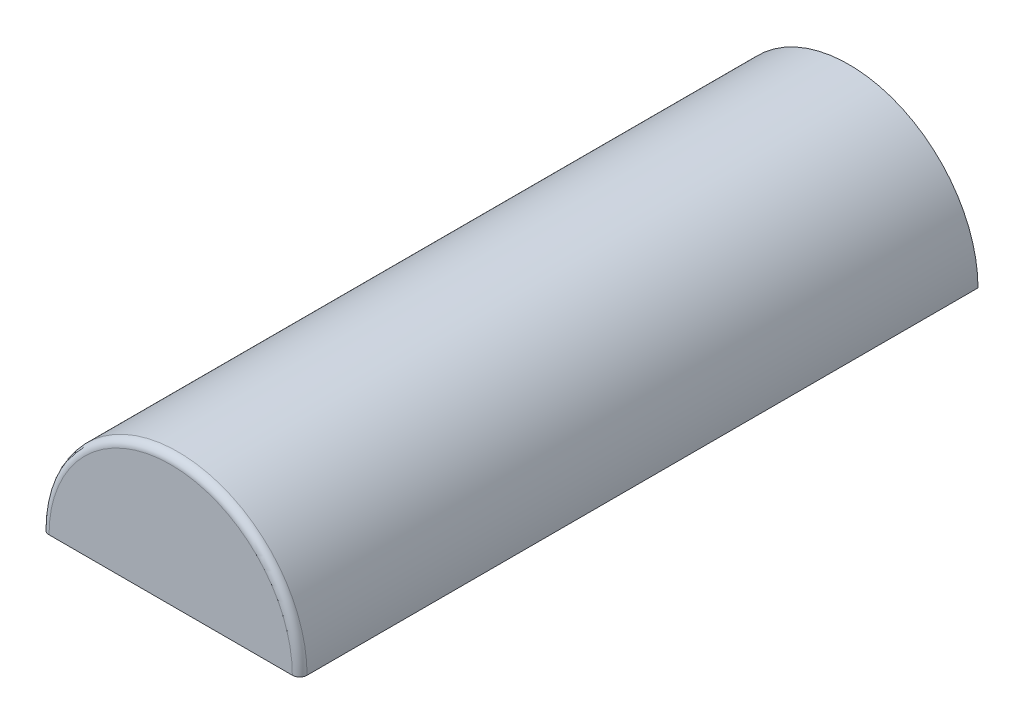
ISO-10303-21;
HEADER;
FILE_DESCRIPTION(('STEP AP214'),'2;1');
FILE_NAME('part.step','',(''),(''),'','','');
FILE_SCHEMA(('AUTOMOTIVE_DESIGN { 1 0 10303 214 1 1 1 1 }'));
ENDSEC;
DATA;
#1=APPLICATION_CONTEXT('core data for automotive mechanical design processes');
#2=APPLICATION_PROTOCOL_DEFINITION('international standard','automotive_design',2000,#1);
#3=PRODUCT_CONTEXT('',#1,'mechanical');
#4=PRODUCT('Part','Part','',(#3));
#5=PRODUCT_RELATED_PRODUCT_CATEGORY('part','',(#4));
#6=PRODUCT_DEFINITION_FORMATION('','',#4);
#7=PRODUCT_DEFINITION_CONTEXT('part definition',#1,'design');
#8=PRODUCT_DEFINITION('design','',#6,#7);
#9=PRODUCT_DEFINITION_SHAPE('','',#8);
#10=(LENGTH_UNIT() NAMED_UNIT(*) SI_UNIT(.MILLI.,.METRE.));
#11=(NAMED_UNIT(*) PLANE_ANGLE_UNIT() SI_UNIT($,.RADIAN.));
#12=(NAMED_UNIT(*) SI_UNIT($,.STERADIAN.) SOLID_ANGLE_UNIT());
#13=UNCERTAINTY_MEASURE_WITH_UNIT(LENGTH_MEASURE(1.E-05),#10,'distance_accuracy_value','');
#14=(GEOMETRIC_REPRESENTATION_CONTEXT(3) GLOBAL_UNCERTAINTY_ASSIGNED_CONTEXT((#13)) GLOBAL_UNIT_ASSIGNED_CONTEXT((#10,
#11,#12)) REPRESENTATION_CONTEXT('',''));
#15=CARTESIAN_POINT('',(0.,0.,0.));
#16=DIRECTION('',(0.,0.,1.));
#17=DIRECTION('',(1.,0.,0.));
#18=AXIS2_PLACEMENT_3D('',#15,#16,#17);
#19=CARTESIAN_POINT('',(-175.,0.,920.));
#20=DIRECTION('',(0.,1.,0.));
#21=DIRECTION('',(0.,0.,1.));
#22=AXIS2_PLACEMENT_3D('',#19,#20,#21);
#23=PLANE('',#22);
#24=DIRECTION('',(1.,0.,0.));
#25=VECTOR('',#24,1.);
#26=CARTESIAN_POINT('',(-175.,0.,920.));
#27=LINE('',#26,#25);
#28=CARTESIAN_POINT('',(-165.,0.,920.));
#29=VERTEX_POINT('',#28);
#30=CARTESIAN_POINT('',(165.,0.,920.));
#31=VERTEX_POINT('',#30);
#32=EDGE_CURVE('E118',#29,#31,#27,.T.);
#33=ORIENTED_EDGE('',*,*,#32,.F.);
#34=CARTESIAN_POINT('',(-165.,0.,910.));
#35=DIRECTION('',(0.,1.,0.));
#36=DIRECTION('',(0.,0.,1.));
#37=AXIS2_PLACEMENT_3D('',#34,#35,#36);
#38=CIRCLE('',#37,10.);
#39=CARTESIAN_POINT('',(-175.,0.,910.));
#40=VERTEX_POINT('',#39);
#41=EDGE_CURVE('E49',#29,#40,#38,.F.);
#42=ORIENTED_EDGE('',*,*,#41,.T.);
#43=DIRECTION('',(0.,0.,-1.));
#44=VECTOR('',#43,1.);
#45=CARTESIAN_POINT('',(-175.,0.,920.));
#46=LINE('',#45,#44);
#47=CARTESIAN_POINT('',(-175.,0.,0.));
#48=VERTEX_POINT('',#47);
#49=EDGE_CURVE('E129',#40,#48,#46,.T.);
#50=ORIENTED_EDGE('',*,*,#49,.T.);
#51=DIRECTION('',(1.,0.,0.));
#52=VECTOR('',#51,1.);
#53=CARTESIAN_POINT('',(-175.,0.,0.));
#54=LINE('',#53,#52);
#55=CARTESIAN_POINT('',(175.,0.,0.));
#56=VERTEX_POINT('',#55);
#57=EDGE_CURVE('E122',#48,#56,#54,.T.);
#58=ORIENTED_EDGE('',*,*,#57,.T.);
#59=DIRECTION('',(0.,0.,-1.));
#60=VECTOR('',#59,1.);
#61=CARTESIAN_POINT('',(175.,0.,920.));
#62=LINE('',#61,#60);
#63=CARTESIAN_POINT('',(175.,0.,910.));
#64=VERTEX_POINT('',#63);
#65=EDGE_CURVE('E121',#64,#56,#62,.T.);
#66=ORIENTED_EDGE('',*,*,#65,.F.);
#67=CARTESIAN_POINT('',(165.,0.,910.));
#68=DIRECTION('',(0.,1.,0.));
#69=DIRECTION('',(0.,0.,1.));
#70=AXIS2_PLACEMENT_3D('',#67,#68,#69);
#71=CIRCLE('',#70,10.);
#72=EDGE_CURVE('E134',#64,#31,#71,.F.);
#73=ORIENTED_EDGE('',*,*,#72,.T.);
#74=EDGE_LOOP('',(#33,#42,#50,#58,#66,#73));
#75=FACE_BOUND('',#74,.T.);
#76=CARTESIAN_POINT('',(-165.,0.,910.));
#77=DIRECTION('',(0.,1.,0.));
#78=DIRECTION('',(0.,0.,1.));
#79=AXIS2_PLACEMENT_3D('',#76,#77,#78);
#80=CIRCLE('',#79,8.);
#81=CARTESIAN_POINT('',(-165.,0.,918.));
#82=VERTEX_POINT('',#81);
#83=CARTESIAN_POINT('',(-173.,0.,910.));
#84=VERTEX_POINT('',#83);
#85=EDGE_CURVE('E115',#82,#84,#80,.F.);
#86=ORIENTED_EDGE('',*,*,#85,.F.);
#87=DIRECTION('',(1.,0.,0.));
#88=VECTOR('',#87,1.);
#89=CARTESIAN_POINT('',(-175.,0.,918.));
#90=LINE('',#89,#88);
#91=CARTESIAN_POINT('',(165.,0.,918.));
#92=VERTEX_POINT('',#91);
#93=EDGE_CURVE('E107',#82,#92,#90,.T.);
#94=ORIENTED_EDGE('',*,*,#93,.T.);
#95=CARTESIAN_POINT('',(165.,0.,910.));
#96=DIRECTION('',(0.,1.,0.));
#97=DIRECTION('',(0.,0.,1.));
#98=AXIS2_PLACEMENT_3D('',#95,#96,#97);
#99=CIRCLE('',#98,8.);
#100=CARTESIAN_POINT('',(173.,0.,910.));
#101=VERTEX_POINT('',#100);
#102=EDGE_CURVE('E114',#101,#92,#99,.F.);
#103=ORIENTED_EDGE('',*,*,#102,.F.);
#104=DIRECTION('',(0.,0.,-1.));
#105=VECTOR('',#104,1.);
#106=CARTESIAN_POINT('',(173.,0.,910.));
#107=LINE('',#106,#105);
#108=CARTESIAN_POINT('',(173.,0.,2.));
#109=VERTEX_POINT('',#108);
#110=EDGE_CURVE('E56',#101,#109,#107,.T.);
#111=ORIENTED_EDGE('',*,*,#110,.T.);
#112=DIRECTION('',(1.,0.,0.));
#113=VECTOR('',#112,1.);
#114=CARTESIAN_POINT('',(-175.,0.,2.));
#115=LINE('',#114,#113);
#116=CARTESIAN_POINT('',(-173.,0.,2.));
#117=VERTEX_POINT('',#116);
#118=EDGE_CURVE('E104',#117,#109,#115,.T.);
#119=ORIENTED_EDGE('',*,*,#118,.F.);
#120=DIRECTION('',(0.,0.,-1.));
#121=VECTOR('',#120,1.);
#122=CARTESIAN_POINT('',(-173.,0.,910.));
#123=LINE('',#122,#121);
#124=EDGE_CURVE('E92',#84,#117,#123,.T.);
#125=ORIENTED_EDGE('',*,*,#124,.F.);
#126=EDGE_LOOP('',(#86,#94,#103,#111,#119,#125));
#127=FACE_BOUND('',#126,.T.);
#128=ADVANCED_FACE('F41',(#75,#127),#23,.F.);
#129=CARTESIAN_POINT('',(0.,0.,920.));
#130=DIRECTION('',(0.,0.,-1.));
#131=DIRECTION('',(-1.,0.,0.));
#132=AXIS2_PLACEMENT_3D('',#129,#130,#131);
#133=CYLINDRICAL_SURFACE('',#132,175.);
#134=ORIENTED_EDGE('',*,*,#49,.F.);
#135=CARTESIAN_POINT('',(0.,0.,910.));
#136=DIRECTION('',(0.,0.,1.));
#137=DIRECTION('',(1.,0.,0.));
#138=AXIS2_PLACEMENT_3D('',#135,#136,#137);
#139=CIRCLE('',#138,175.);
#140=EDGE_CURVE('E11',#40,#64,#139,.F.);
#141=ORIENTED_EDGE('',*,*,#140,.T.);
#142=ORIENTED_EDGE('',*,*,#65,.T.);
#143=CARTESIAN_POINT('',(0.,0.,0.));
#144=DIRECTION('',(0.,0.,1.));
#145=DIRECTION('',(1.,0.,0.));
#146=AXIS2_PLACEMENT_3D('',#143,#144,#145);
#147=CIRCLE('',#146,175.);
#148=EDGE_CURVE('E123',#56,#48,#147,.T.);
#149=ORIENTED_EDGE('',*,*,#148,.T.);
#150=EDGE_LOOP('',(#134,#141,#142,#149));
#151=FACE_BOUND('',#150,.T.);
#152=ADVANCED_FACE('F143',(#151),#133,.T.);
#153=CARTESIAN_POINT('',(0.,0.,920.));
#154=DIRECTION('',(0.,0.,1.));
#155=DIRECTION('',(1.,0.,0.));
#156=AXIS2_PLACEMENT_3D('',#153,#154,#155);
#157=PLANE('',#156);
#158=ORIENTED_EDGE('',*,*,#32,.T.);
#159=CARTESIAN_POINT('',(0.,0.,920.));
#160=DIRECTION('',(0.,0.,1.));
#161=DIRECTION('',(1.,0.,0.));
#162=AXIS2_PLACEMENT_3D('',#159,#160,#161);
#163=CIRCLE('',#162,165.);
#164=EDGE_CURVE('E131',#31,#29,#163,.T.);
#165=ORIENTED_EDGE('',*,*,#164,.T.);
#166=EDGE_LOOP('',(#158,#165));
#167=FACE_BOUND('',#166,.T.);
#168=ADVANCED_FACE('F141',(#167),#157,.T.);
#169=CARTESIAN_POINT('',(0.,0.,0.));
#170=DIRECTION('',(0.,0.,1.));
#171=DIRECTION('',(1.,0.,0.));
#172=AXIS2_PLACEMENT_3D('',#169,#170,#171);
#173=PLANE('',#172);
#174=ORIENTED_EDGE('',*,*,#148,.F.);
#175=ORIENTED_EDGE('',*,*,#57,.F.);
#176=EDGE_LOOP('',(#174,#175));
#177=FACE_BOUND('',#176,.T.);
#178=ADVANCED_FACE('F147',(#177),#173,.F.);
#179=CARTESIAN_POINT('',(0.,0.,910.));
#180=DIRECTION('',(0.,0.,1.));
#181=DIRECTION('',(1.,0.,0.));
#182=AXIS2_PLACEMENT_3D('',#179,#180,#181);
#183=TOROIDAL_SURFACE('',#182,165.,10.);
#184=ORIENTED_EDGE('',*,*,#72,.F.);
#185=ORIENTED_EDGE('',*,*,#140,.F.);
#186=ORIENTED_EDGE('',*,*,#41,.F.);
#187=ORIENTED_EDGE('',*,*,#164,.F.);
#188=EDGE_LOOP('',(#184,#185,#186,#187));
#189=FACE_BOUND('',#188,.T.);
#190=ADVANCED_FACE('F43',(#189),#183,.T.);
#191=CARTESIAN_POINT('',(0.,0.,920.));
#192=DIRECTION('',(0.,0.,-1.));
#193=DIRECTION('',(-1.,0.,0.));
#194=AXIS2_PLACEMENT_3D('',#191,#192,#193);
#195=CYLINDRICAL_SURFACE('',#194,173.);
#196=ORIENTED_EDGE('',*,*,#124,.T.);
#197=CARTESIAN_POINT('',(0.,0.,2.));
#198=DIRECTION('',(0.,0.,1.));
#199=DIRECTION('',(1.,0.,0.));
#200=AXIS2_PLACEMENT_3D('',#197,#198,#199);
#201=CIRCLE('',#200,173.);
#202=EDGE_CURVE('E95',#109,#117,#201,.T.);
#203=ORIENTED_EDGE('',*,*,#202,.F.);
#204=ORIENTED_EDGE('',*,*,#110,.F.);
#205=CARTESIAN_POINT('',(0.,0.,910.));
#206=DIRECTION('',(0.,0.,-1.));
#207=DIRECTION('',(-1.,0.,0.));
#208=AXIS2_PLACEMENT_3D('',#205,#206,#207);
#209=CIRCLE('',#208,173.);
#210=EDGE_CURVE('E96',#84,#101,#209,.T.);
#211=ORIENTED_EDGE('',*,*,#210,.F.);
#212=EDGE_LOOP('',(#196,#203,#204,#211));
#213=FACE_BOUND('',#212,.T.);
#214=ADVANCED_FACE('F94',(#213),#195,.F.);
#215=CARTESIAN_POINT('',(0.,0.,918.));
#216=DIRECTION('',(0.,0.,1.));
#217=DIRECTION('',(1.,0.,0.));
#218=AXIS2_PLACEMENT_3D('',#215,#216,#217);
#219=PLANE('',#218);
#220=ORIENTED_EDGE('',*,*,#93,.F.);
#221=CARTESIAN_POINT('',(0.,0.,918.));
#222=DIRECTION('',(0.,0.,1.));
#223=DIRECTION('',(1.,0.,0.));
#224=AXIS2_PLACEMENT_3D('',#221,#222,#223);
#225=CIRCLE('',#224,165.);
#226=EDGE_CURVE('E100',#92,#82,#225,.T.);
#227=ORIENTED_EDGE('',*,*,#226,.F.);
#228=EDGE_LOOP('',(#220,#227));
#229=FACE_BOUND('',#228,.T.);
#230=ADVANCED_FACE('F186',(#229),#219,.F.);
#231=CARTESIAN_POINT('',(0.,0.,2.));
#232=DIRECTION('',(0.,0.,1.));
#233=DIRECTION('',(1.,0.,0.));
#234=AXIS2_PLACEMENT_3D('',#231,#232,#233);
#235=PLANE('',#234);
#236=ORIENTED_EDGE('',*,*,#202,.T.);
#237=ORIENTED_EDGE('',*,*,#118,.T.);
#238=EDGE_LOOP('',(#236,#237));
#239=FACE_BOUND('',#238,.T.);
#240=ADVANCED_FACE('F103',(#239),#235,.T.);
#241=CARTESIAN_POINT('',(0.,0.,910.));
#242=DIRECTION('',(0.,0.,1.));
#243=DIRECTION('',(1.,0.,0.));
#244=AXIS2_PLACEMENT_3D('',#241,#242,#243);
#245=TOROIDAL_SURFACE('',#244,165.,8.);
#246=ORIENTED_EDGE('',*,*,#102,.T.);
#247=ORIENTED_EDGE('',*,*,#226,.T.);
#248=ORIENTED_EDGE('',*,*,#85,.T.);
#249=ORIENTED_EDGE('',*,*,#210,.T.);
#250=EDGE_LOOP('',(#246,#247,#248,#249));
#251=FACE_BOUND('',#250,.T.);
#252=ADVANCED_FACE('F204',(#251),#245,.F.);
#253=CLOSED_SHELL('',(#128,#152,#168,#178,#190,#214,#230,#240,#252));
#254=MANIFOLD_SOLID_BREP('B2',#253);
#255=ADVANCED_BREP_SHAPE_REPRESENTATION('',(#18,#254),#14);
#256=SHAPE_DEFINITION_REPRESENTATION(#9,#255);
ENDSEC;
END-ISO-10303-21;
